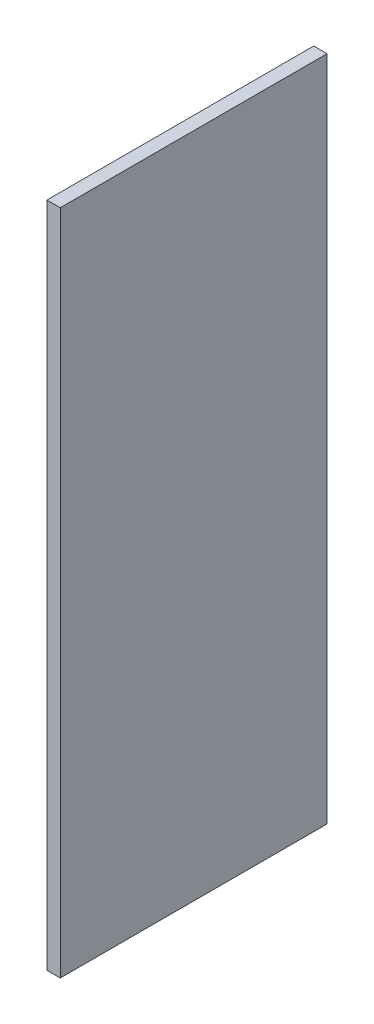
ISO-10303-21;
HEADER;
FILE_DESCRIPTION(('STEP AP214'),'2;1');
FILE_NAME('part.step','',(''),(''),'','','');
FILE_SCHEMA(('AUTOMOTIVE_DESIGN { 1 0 10303 214 1 1 1 1 }'));
ENDSEC;
DATA;
#1=APPLICATION_CONTEXT('core data for automotive mechanical design processes');
#2=APPLICATION_PROTOCOL_DEFINITION('international standard','automotive_design',2000,#1);
#3=PRODUCT_CONTEXT('',#1,'mechanical');
#4=PRODUCT('Part','Part','',(#3));
#5=PRODUCT_RELATED_PRODUCT_CATEGORY('part','',(#4));
#6=PRODUCT_DEFINITION_FORMATION('','',#4);
#7=PRODUCT_DEFINITION_CONTEXT('part definition',#1,'design');
#8=PRODUCT_DEFINITION('design','',#6,#7);
#9=PRODUCT_DEFINITION_SHAPE('','',#8);
#10=(LENGTH_UNIT() NAMED_UNIT(*) SI_UNIT(.MILLI.,.METRE.));
#11=(NAMED_UNIT(*) PLANE_ANGLE_UNIT() SI_UNIT($,.RADIAN.));
#12=(NAMED_UNIT(*) SI_UNIT($,.STERADIAN.) SOLID_ANGLE_UNIT());
#13=UNCERTAINTY_MEASURE_WITH_UNIT(LENGTH_MEASURE(1.E-05),#10,'distance_accuracy_value','');
#14=(GEOMETRIC_REPRESENTATION_CONTEXT(3) GLOBAL_UNCERTAINTY_ASSIGNED_CONTEXT((#13)) GLOBAL_UNIT_ASSIGNED_CONTEXT((#10,
#11,#12)) REPRESENTATION_CONTEXT('',''));
#15=CARTESIAN_POINT('',(0.,0.,0.));
#16=DIRECTION('',(0.,0.,1.));
#17=DIRECTION('',(1.,0.,0.));
#18=AXIS2_PLACEMENT_3D('',#15,#16,#17);
#19=CARTESIAN_POINT('',(1.,0.,10.));
#20=DIRECTION('',(0.,0.,-1.));
#21=DIRECTION('',(-1.,0.,0.));
#22=AXIS2_PLACEMENT_3D('',#19,#20,#21);
#23=PLANE('',#22);
#24=DIRECTION('',(0.,-1.,0.));
#25=VECTOR('',#24,1.);
#26=CARTESIAN_POINT('',(0.,0.,10.));
#27=LINE('',#26,#25);
#28=CARTESIAN_POINT('',(0.,50.,10.));
#29=VERTEX_POINT('',#28);
#30=CARTESIAN_POINT('',(0.,0.,10.));
#31=VERTEX_POINT('',#30);
#32=EDGE_CURVE('E102',#29,#31,#27,.T.);
#33=ORIENTED_EDGE('',*,*,#32,.T.);
#34=DIRECTION('',(-1.,0.,0.));
#35=VECTOR('',#34,1.);
#36=CARTESIAN_POINT('',(1.,0.,10.));
#37=LINE('',#36,#35);
#38=CARTESIAN_POINT('',(1.,0.,10.));
#39=VERTEX_POINT('',#38);
#40=EDGE_CURVE('E11',#39,#31,#37,.T.);
#41=ORIENTED_EDGE('',*,*,#40,.F.);
#42=DIRECTION('',(0.,-1.,0.));
#43=VECTOR('',#42,1.);
#44=CARTESIAN_POINT('',(1.,0.,10.));
#45=LINE('',#44,#43);
#46=CARTESIAN_POINT('',(1.,50.,10.));
#47=VERTEX_POINT('',#46);
#48=EDGE_CURVE('E90',#47,#39,#45,.T.);
#49=ORIENTED_EDGE('',*,*,#48,.F.);
#50=DIRECTION('',(-1.,0.,0.));
#51=VECTOR('',#50,1.);
#52=CARTESIAN_POINT('',(1.,50.,10.));
#53=LINE('',#52,#51);
#54=EDGE_CURVE('E98',#47,#29,#53,.T.);
#55=ORIENTED_EDGE('',*,*,#54,.T.);
#56=EDGE_LOOP('',(#33,#41,#49,#55));
#57=FACE_BOUND('',#56,.T.);
#58=ADVANCED_FACE('F39',(#57),#23,.F.);
#59=CARTESIAN_POINT('',(1.,0.,10.));
#60=DIRECTION('',(0.,1.,0.));
#61=DIRECTION('',(0.,0.,1.));
#62=AXIS2_PLACEMENT_3D('',#59,#60,#61);
#63=PLANE('',#62);
#64=DIRECTION('',(0.,0.,-1.));
#65=VECTOR('',#64,1.);
#66=CARTESIAN_POINT('',(0.,0.,10.));
#67=LINE('',#66,#65);
#68=CARTESIAN_POINT('',(0.,0.,-10.));
#69=VERTEX_POINT('',#68);
#70=EDGE_CURVE('E94',#31,#69,#67,.T.);
#71=ORIENTED_EDGE('',*,*,#70,.T.);
#72=DIRECTION('',(-1.,0.,0.));
#73=VECTOR('',#72,1.);
#74=CARTESIAN_POINT('',(1.,0.,-10.));
#75=LINE('',#74,#73);
#76=CARTESIAN_POINT('',(1.,0.,-10.));
#77=VERTEX_POINT('',#76);
#78=EDGE_CURVE('E47',#77,#69,#75,.T.);
#79=ORIENTED_EDGE('',*,*,#78,.F.);
#80=DIRECTION('',(0.,0.,-1.));
#81=VECTOR('',#80,1.);
#82=CARTESIAN_POINT('',(1.,0.,10.));
#83=LINE('',#82,#81);
#84=EDGE_CURVE('E85',#39,#77,#83,.T.);
#85=ORIENTED_EDGE('',*,*,#84,.F.);
#86=ORIENTED_EDGE('',*,*,#40,.T.);
#87=EDGE_LOOP('',(#71,#79,#85,#86));
#88=FACE_BOUND('',#87,.T.);
#89=ADVANCED_FACE('F93',(#88),#63,.F.);
#90=CARTESIAN_POINT('',(1.,0.,-10.));
#91=DIRECTION('',(0.,0.,1.));
#92=DIRECTION('',(1.,0.,0.));
#93=AXIS2_PLACEMENT_3D('',#90,#91,#92);
#94=PLANE('',#93);
#95=DIRECTION('',(0.,1.,0.));
#96=VECTOR('',#95,1.);
#97=CARTESIAN_POINT('',(0.,0.,-10.));
#98=LINE('',#97,#96);
#99=CARTESIAN_POINT('',(0.,50.,-10.));
#100=VERTEX_POINT('',#99);
#101=EDGE_CURVE('E72',#69,#100,#98,.T.);
#102=ORIENTED_EDGE('',*,*,#101,.T.);
#103=DIRECTION('',(-1.,0.,0.));
#104=VECTOR('',#103,1.);
#105=CARTESIAN_POINT('',(1.,50.,-10.));
#106=LINE('',#105,#104);
#107=CARTESIAN_POINT('',(1.,50.,-10.));
#108=VERTEX_POINT('',#107);
#109=EDGE_CURVE('E95',#108,#100,#106,.T.);
#110=ORIENTED_EDGE('',*,*,#109,.F.);
#111=DIRECTION('',(0.,1.,0.));
#112=VECTOR('',#111,1.);
#113=CARTESIAN_POINT('',(1.,0.,-10.));
#114=LINE('',#113,#112);
#115=EDGE_CURVE('E88',#77,#108,#114,.T.);
#116=ORIENTED_EDGE('',*,*,#115,.F.);
#117=ORIENTED_EDGE('',*,*,#78,.T.);
#118=EDGE_LOOP('',(#102,#110,#116,#117));
#119=FACE_BOUND('',#118,.T.);
#120=ADVANCED_FACE('F96',(#119),#94,.F.);
#121=CARTESIAN_POINT('',(1.,50.,10.));
#122=DIRECTION('',(0.,-1.,0.));
#123=DIRECTION('',(0.,0.,-1.));
#124=AXIS2_PLACEMENT_3D('',#121,#122,#123);
#125=PLANE('',#124);
#126=DIRECTION('',(0.,0.,1.));
#127=VECTOR('',#126,1.);
#128=CARTESIAN_POINT('',(0.,50.,10.));
#129=LINE('',#128,#127);
#130=EDGE_CURVE('E78',#100,#29,#129,.T.);
#131=ORIENTED_EDGE('',*,*,#130,.T.);
#132=ORIENTED_EDGE('',*,*,#54,.F.);
#133=DIRECTION('',(0.,0.,1.));
#134=VECTOR('',#133,1.);
#135=CARTESIAN_POINT('',(1.,50.,10.));
#136=LINE('',#135,#134);
#137=EDGE_CURVE('E55',#108,#47,#136,.T.);
#138=ORIENTED_EDGE('',*,*,#137,.F.);
#139=ORIENTED_EDGE('',*,*,#109,.T.);
#140=EDGE_LOOP('',(#131,#132,#138,#139));
#141=FACE_BOUND('',#140,.T.);
#142=ADVANCED_FACE('F109',(#141),#125,.F.);
#143=CARTESIAN_POINT('',(1.,0.,0.));
#144=DIRECTION('',(-1.,0.,0.));
#145=DIRECTION('',(0.,0.,1.));
#146=AXIS2_PLACEMENT_3D('',#143,#144,#145);
#147=PLANE('',#146);
#148=ORIENTED_EDGE('',*,*,#48,.T.);
#149=ORIENTED_EDGE('',*,*,#84,.T.);
#150=ORIENTED_EDGE('',*,*,#115,.T.);
#151=ORIENTED_EDGE('',*,*,#137,.T.);
#152=EDGE_LOOP('',(#148,#149,#150,#151));
#153=FACE_BOUND('',#152,.T.);
#154=ADVANCED_FACE('F86',(#153),#147,.F.);
#155=CARTESIAN_POINT('',(0.,0.,0.));
#156=DIRECTION('',(-1.,0.,0.));
#157=DIRECTION('',(0.,0.,1.));
#158=AXIS2_PLACEMENT_3D('',#155,#156,#157);
#159=PLANE('',#158);
#160=ORIENTED_EDGE('',*,*,#32,.F.);
#161=ORIENTED_EDGE('',*,*,#130,.F.);
#162=ORIENTED_EDGE('',*,*,#101,.F.);
#163=ORIENTED_EDGE('',*,*,#70,.F.);
#164=EDGE_LOOP('',(#160,#161,#162,#163));
#165=FACE_BOUND('',#164,.T.);
#166=ADVANCED_FACE('F112',(#165),#159,.T.);
#167=CLOSED_SHELL('',(#58,#89,#120,#142,#154,#166));
#168=MANIFOLD_SOLID_BREP('B2',#167);
#169=ADVANCED_BREP_SHAPE_REPRESENTATION('',(#18,#168),#14);
#170=SHAPE_DEFINITION_REPRESENTATION(#9,#169);
ENDSEC;
END-ISO-10303-21;
